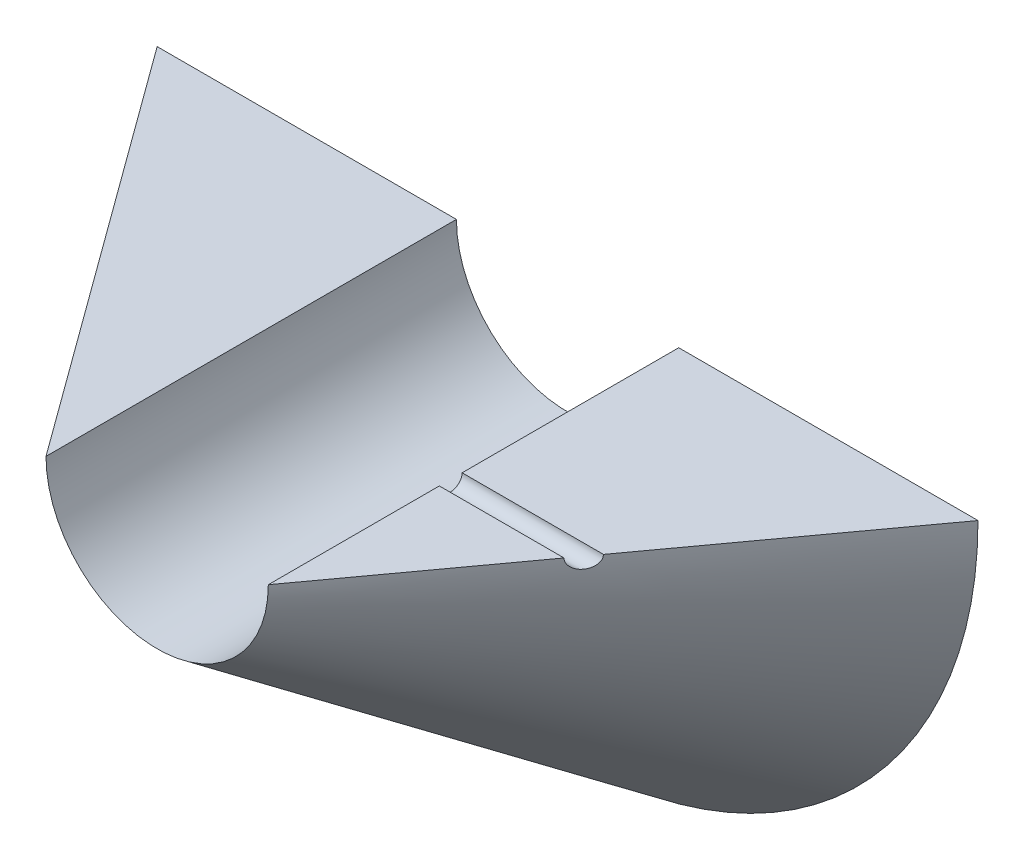
ISO-10303-21;
HEADER;
FILE_DESCRIPTION(('STEP AP214'),'2;1');
FILE_NAME('part.step','',(''),(''),'','','');
FILE_SCHEMA(('AUTOMOTIVE_DESIGN { 1 0 10303 214 1 1 1 1 }'));
ENDSEC;
DATA;
#1=APPLICATION_CONTEXT('core data for automotive mechanical design processes');
#2=APPLICATION_PROTOCOL_DEFINITION('international standard','automotive_design',2000,#1);
#3=PRODUCT_CONTEXT('',#1,'mechanical');
#4=PRODUCT('Part','Part','',(#3));
#5=PRODUCT_RELATED_PRODUCT_CATEGORY('part','',(#4));
#6=PRODUCT_DEFINITION_FORMATION('','',#4);
#7=PRODUCT_DEFINITION_CONTEXT('part definition',#1,'design');
#8=PRODUCT_DEFINITION('design','',#6,#7);
#9=PRODUCT_DEFINITION_SHAPE('','',#8);
#10=(LENGTH_UNIT() NAMED_UNIT(*) SI_UNIT(.MILLI.,.METRE.));
#11=(NAMED_UNIT(*) PLANE_ANGLE_UNIT() SI_UNIT($,.RADIAN.));
#12=(NAMED_UNIT(*) SI_UNIT($,.STERADIAN.) SOLID_ANGLE_UNIT());
#13=UNCERTAINTY_MEASURE_WITH_UNIT(LENGTH_MEASURE(1.E-05),#10,'distance_accuracy_value','');
#14=(GEOMETRIC_REPRESENTATION_CONTEXT(3) GLOBAL_UNCERTAINTY_ASSIGNED_CONTEXT((#13)) GLOBAL_UNIT_ASSIGNED_CONTEXT((#10,
#11,#12)) REPRESENTATION_CONTEXT('',''));
#15=CARTESIAN_POINT('',(0.,0.,0.));
#16=DIRECTION('',(0.,0.,1.));
#17=DIRECTION('',(1.,0.,0.));
#18=AXIS2_PLACEMENT_3D('',#15,#16,#17);
#19=CARTESIAN_POINT('',(0.,0.,180.));
#20=DIRECTION('',(0.,0.,1.));
#21=DIRECTION('',(1.,0.,0.));
#22=AXIS2_PLACEMENT_3D('',#19,#20,#21);
#23=CYLINDRICAL_SURFACE('',#22,48.75);
#24=DIRECTION('',(0.,0.,1.));
#25=VECTOR('',#24,1.);
#26=CARTESIAN_POINT('',(-48.75,0.,180.));
#27=LINE('',#26,#25);
#28=CARTESIAN_POINT('',(-48.75,0.,180.));
#29=VERTEX_POINT('',#28);
#30=CARTESIAN_POINT('',(-48.75,0.,0.));
#31=VERTEX_POINT('',#30);
#32=EDGE_CURVE('E49',#29,#31,#27,.F.);
#33=ORIENTED_EDGE('',*,*,#32,.F.);
#34=CARTESIAN_POINT('',(0.,0.,180.));
#35=DIRECTION('',(0.,0.,1.));
#36=DIRECTION('',(1.,0.,0.));
#37=AXIS2_PLACEMENT_3D('',#34,#35,#36);
#38=CIRCLE('',#37,48.75);
#39=CARTESIAN_POINT('',(48.75,0.,180.));
#40=VERTEX_POINT('',#39);
#41=EDGE_CURVE('E95',#29,#40,#38,.T.);
#42=ORIENTED_EDGE('',*,*,#41,.T.);
#43=DIRECTION('',(0.,0.,1.));
#44=VECTOR('',#43,1.);
#45=CARTESIAN_POINT('',(48.75,0.,180.));
#46=LINE('',#45,#44);
#47=CARTESIAN_POINT('',(48.75,0.,105.));
#48=VERTEX_POINT('',#47);
#49=EDGE_CURVE('E84',#48,#40,#46,.T.);
#50=ORIENTED_EDGE('',*,*,#49,.F.);
#51=CARTESIAN_POINT('',(48.75,0.,95.));
#52=CARTESIAN_POINT('',(48.750000389197,-0.14008100086284,94.9999986018309));
#53=CARTESIAN_POINT('',(48.7493950083053,-0.280140737873493,95.0058890159541));
#54=CARTESIAN_POINT('',(48.7469912287984,-0.559305925529234,95.0294068089419));
#55=CARTESIAN_POINT('',(48.7451925455075,-0.698411140459885,95.0470369884638));
#56=CARTESIAN_POINT('',(48.7404503592909,-0.974737830645201,95.0939279402502));
#57=CARTESIAN_POINT('',(48.737505949223,-1.11195772382351,95.1231979288691));
#58=CARTESIAN_POINT('',(48.7305544431504,-1.38347878134987,95.1931665631875));
#59=CARTESIAN_POINT('',(48.7265469582316,-1.51777885802131,95.2338693917857));
#60=CARTESIAN_POINT('',(48.7175873522136,-1.7823254585363,95.3263577551216));
#61=CARTESIAN_POINT('',(48.7126361631751,-1.91257583570178,95.3781323607879));
#62=CARTESIAN_POINT('',(48.701923936988,-2.16829177987035,95.4924361395613));
#63=CARTESIAN_POINT('',(48.696162601784,-2.2937555641763,95.5549692726647));
#64=CARTESIAN_POINT('',(48.6839968800058,-2.5388978794622,95.6902913994103));
#65=CARTESIAN_POINT('',(48.6775928619544,-2.65857966824321,95.7630745251197));
#66=CARTESIAN_POINT('',(48.6643161559048,-2.89144274282538,95.9184369559612));
#67=CARTESIAN_POINT('',(48.6574432951223,-3.00462160346189,96.0010198810297));
#68=CARTESIAN_POINT('',(48.6434027571373,-3.22397034323184,96.1756405164407));
#69=CARTESIAN_POINT('',(48.6362342596262,-3.33011824606443,96.2677057671708));
#70=CARTESIAN_POINT('',(48.6218213751467,-3.53432740876358,96.4604728753795));
#71=CARTESIAN_POINT('',(48.614576961105,-3.63238566486568,96.5611779128343));
#72=CARTESIAN_POINT('',(48.600221908122,-3.8196530425597,96.7704550377934));
#73=CARTESIAN_POINT('',(48.5931112269238,-3.90886499881192,96.8790245858134));
#74=CARTESIAN_POINT('',(48.5792198977998,-4.07787800390798,97.1033399806117));
#75=CARTESIAN_POINT('',(48.5724393726231,-4.15767556801212,97.219088460637));
#76=CARTESIAN_POINT('',(48.5593915128267,-4.30739554051586,97.4571373901257));
#77=CARTESIAN_POINT('',(48.55312516295,-4.37729917752714,97.5794497025295));
#78=CARTESIAN_POINT('',(48.5412967585839,-4.50657563732373,97.8296061375659));
#79=CARTESIAN_POINT('',(48.5357349658752,-4.56594454916064,97.9574522927828));
#80=CARTESIAN_POINT('',(48.5254804614672,-4.67366907148744,98.217689519941));
#81=CARTESIAN_POINT('',(48.5207874115692,-4.7220289694427,98.3500787993653));
#82=CARTESIAN_POINT('',(48.5124001208882,-4.80742627588238,98.6185052355794));
#83=CARTESIAN_POINT('',(48.5087062478272,-4.84445951652841,98.7545437151754));
#84=CARTESIAN_POINT('',(48.4993223283529,-4.93785036616057,99.1656124433031));
#85=CARTESIAN_POINT('',(48.4952805494567,-4.97700104155831,99.4448123428154));
#86=CARTESIAN_POINT('',(48.4920997750474,-5.00789044245951,100.005695122123));
#87=CARTESIAN_POINT('',(48.4929606443874,-4.99963047488887,100.287377933261));
#88=CARTESIAN_POINT('',(48.4994651170514,-4.9361304439657,100.84428299938));
#89=CARTESIAN_POINT('',(48.5050904528067,-4.88106981740609,101.119525809727));
#90=CARTESIAN_POINT('',(48.5204637315776,-4.72579415216424,101.65683235715));
#91=CARTESIAN_POINT('',(48.5302117328848,-4.62557847502081,101.918895907822));
#92=CARTESIAN_POINT('',(48.5527523909515,-4.38264425232442,102.422984278809));
#93=CARTESIAN_POINT('',(48.5655507320491,-4.23984622785899,102.664970536143));
#94=CARTESIAN_POINT('',(48.5927454108909,-3.91585672545949,103.12160957111));
#95=CARTESIAN_POINT('',(48.6071417978411,-3.73466406514936,103.336261506646));
#96=CARTESIAN_POINT('',(48.6359918294384,-3.3380272417351,103.733182554229));
#97=CARTESIAN_POINT('',(48.6504454299169,-3.12242809707303,103.915296835475));
#98=CARTESIAN_POINT('',(48.6777183357708,-2.66363602583515,104.24077219106));
#99=CARTESIAN_POINT('',(48.6905376391663,-2.42044306583126,104.384133218452));
#100=CARTESIAN_POINT('',(48.7131020876591,-1.91325834758283,104.628027014304));
#101=CARTESIAN_POINT('',(48.7228466565943,-1.64926270277589,104.728551757082));
#102=CARTESIAN_POINT('',(48.7381578744169,-1.10801780887595,104.883805091289));
#103=CARTESIAN_POINT('',(48.7437246547517,-0.830768977065377,104.938535123583));
#104=CARTESIAN_POINT('',(48.7500361632012,-0.272228441535443,105.00044864221));
#105=CARTESIAN_POINT('',(48.7508025560036,0.00903934777978221,105.007845750611));
#106=CARTESIAN_POINT('',(48.7474850668982,0.568810634624786,104.975444758929));
#107=CARTESIAN_POINT('',(48.7434012539818,0.847314171417597,104.93564733016));
#108=CARTESIAN_POINT('',(48.7308560801636,1.39303341447142,104.81016423428));
#109=CARTESIAN_POINT('',(48.7224042785875,1.66027239745354,104.724578759789));
#110=CARTESIAN_POINT('',(48.7020711161284,2.17660055900645,104.510052035007));
#111=CARTESIAN_POINT('',(48.6901896745848,2.42568931053593,104.381109765012));
#112=CARTESIAN_POINT('',(48.6642718407333,2.8996110877734,104.083001330848));
#113=CARTESIAN_POINT('',(48.6502280017268,3.12435554042963,103.913695015106));
#114=CARTESIAN_POINT('',(48.621584691777,3.54231194552546,103.539864177106));
#115=CARTESIAN_POINT('',(48.606985206158,3.73552306438865,103.335338724132));
#116=CARTESIAN_POINT('',(48.5788106240481,4.08567185517549,102.895946149536));
#117=CARTESIAN_POINT('',(48.5652396221104,4.24246919531283,102.660966909692));
#118=CARTESIAN_POINT('',(48.5407216552142,4.51437295777038,102.167875136452));
#119=CARTESIAN_POINT('',(48.5297746527683,4.62947997570706,101.909762933614));
#120=CARTESIAN_POINT('',(48.511768592767,4.8145067034086,101.378263175584));
#121=CARTESIAN_POINT('',(48.5047023901735,4.88450949714478,101.104904720184));
#122=CARTESIAN_POINT('',(48.4952408395981,4.97759035860086,100.550083631075));
#123=CARTESIAN_POINT('',(48.4928453500628,5.00066984840871,100.268621243232));
#124=CARTESIAN_POINT('',(48.4929473956605,4.99964290141229,99.8474570227359));
#125=CARTESIAN_POINT('',(48.4935928392565,4.99340252271699,99.7074908372863));
#126=CARTESIAN_POINT('',(48.4960784705341,4.96921054801502,99.4285989653847));
#127=CARTESIAN_POINT('',(48.4979182145855,4.95126330058479,99.2896729119443));
#128=CARTESIAN_POINT('',(48.5027427204151,4.90377491789048,99.0137948239799));
#129=CARTESIAN_POINT('',(48.5057279015383,4.87422953645153,98.8768435314916));
#130=CARTESIAN_POINT('',(48.5127559314431,4.80377618536093,98.6059744620394));
#131=CARTESIAN_POINT('',(48.5167983936194,4.76287236869493,98.4720555956482));
#132=CARTESIAN_POINT('',(48.525827445254,4.66998352416419,98.2081206581476));
#133=CARTESIAN_POINT('',(48.5308142285033,4.6179962215002,98.0781053944811));
#134=CARTESIAN_POINT('',(48.5415877348515,4.50334014269483,97.8229651191824));
#135=CARTESIAN_POINT('',(48.5473741657096,4.4406752668614,97.6978383423255));
#136=CARTESIAN_POINT('',(48.5595869146512,4.30507283476307,97.453255580476));
#137=CARTESIAN_POINT('',(48.5660134594491,4.23213163503253,97.3338016269521));
#138=CARTESIAN_POINT('',(48.5793210747985,4.0765372254649,97.1014861820133));
#139=CARTESIAN_POINT('',(48.5862019798918,3.99388754258636,96.9886223186799));
#140=CARTESIAN_POINT('',(48.6002611013155,3.8190116579077,96.7696946920308));
#141=CARTESIAN_POINT('',(48.6074405953638,3.72674104488739,96.6636664823935));
#142=CARTESIAN_POINT('',(48.6218597096454,3.5336420168319,96.4597909416014));
#143=CARTESIAN_POINT('',(48.6290993069958,3.4328167350974,96.3619406409847));
#144=CARTESIAN_POINT('',(48.6434412404114,3.22322228659948,96.1750073996124));
#145=CARTESIAN_POINT('',(48.650543490368,3.1144483284338,96.0859298242102));
#146=CARTESIAN_POINT('',(48.6644030484974,2.88981516863571,95.9172695742775));
#147=CARTESIAN_POINT('',(48.6711604830766,2.77395859816484,95.8376834057625));
#148=CARTESIAN_POINT('',(48.6841620584364,2.53557744063651,95.6883076711548));
#149=CARTESIAN_POINT('',(48.6904045927547,2.41303383009732,95.6185483180658));
#150=CARTESIAN_POINT('',(48.7021740092982,2.16251348650119,95.4896370889704));
#151=CARTESIAN_POINT('',(48.7077011534379,2.03453876476771,95.4304813277677));
#152=CARTESIAN_POINT('',(48.7178810869501,1.77412573229979,95.3232180732733));
#153=CARTESIAN_POINT('',(48.7225345887302,1.64169116318527,95.275101570895));
#154=CARTESIAN_POINT('',(48.7308395507551,1.37324976919271,95.1902179849387));
#155=CARTESIAN_POINT('',(48.734491256199,1.23724382738741,95.1534481238882));
#156=CARTESIAN_POINT('',(48.7416578208933,0.919647422003384,95.0818324431433));
#157=CARTESIAN_POINT('',(48.7447736658721,0.737087728326719,95.0511749660776));
#158=CARTESIAN_POINT('',(48.7489444941515,0.36967301153783,95.0102597116689));
#159=CARTESIAN_POINT('',(48.749999486507,0.184817998514194,95.0000018446957));
#160=CARTESIAN_POINT('',(48.75,0.,95.));
#161=B_SPLINE_CURVE_WITH_KNOTS('',3,(#51,#52,#53,#54,#55,#56,#57,#58,#59,#60,#61,#62,#63,#64,
#65,#66,#67,#68,#69,#70,#71,#72,#73,#74,#75,#76,#77,#78,#79,#80,#81,#82,#83,#84,#85,#86,#87,#88,
#89,#90,#91,#92,#93,#94,#95,#96,#97,#98,#99,#100,#101,#102,#103,#104,#105,#106,#107,#108,#109,
#110,#111,#112,#113,#114,#115,#116,#117,#118,#119,#120,#121,#122,#123,#124,#125,#126,#127,#128,
#129,#130,#131,#132,#133,#134,#135,#136,#137,#138,#139,#140,#141,#142,#143,#144,#145,#146,#147,
#148,#149,#150,#151,#152,#153,#154,#155,#156,#157,#158,#159,#160),.UNSPECIFIED.,.T.,.F.,(4,2,2,
2,2,2,2,2,2,2,2,2,2,2,2,2,2,2,2,2,2,2,2,2,2,2,2,2,2,2,2,2,2,2,2,2,2,2,2,2,2,2,2,2,2,2,2,2,2,2,2,
2,2,2,4),(0.,0.420081372263408,0.840262995736704,1.26077798189679,1.68144702145216,
2.1017027151597,2.52211342872985,2.9422844359281,3.36261113558632,3.78419502857095,
4.20593476173172,4.62753891521351,5.04929863919035,5.47184812352873,5.89455414991491,
6.31709527054133,6.7397916859001,7.58128440501172,8.42275392757352,9.26101167859738,
10.0992812823782,10.939125394758,11.7789953741871,12.62276120516,13.4665280583104,
14.3104529277644,15.1543512433517,15.9944381904937,16.8345131880398,17.6727574216204,
18.5110213711709,19.352239444942,20.1934797525183,21.0379101468124,21.8823284765202,
22.7251868695829,23.5680197180541,23.9879313067028,24.4076870057928,24.8275965245294,
25.2473527134102,25.6671951370627,26.086884528002,26.5067230958436,26.92640961108,
27.3481272649718,27.7696911185456,28.1915112178113,28.6131755538511,29.0361092707313,
29.458887704913,29.8813198745028,30.3036485574235,30.8578917387347,31.4121324848502),.UNSPECIFIED.);
#162=CARTESIAN_POINT('',(48.75,0.,95.));
#163=VERTEX_POINT('',#162);
#164=EDGE_CURVE('E94',#163,#48,#161,.T.);
#165=ORIENTED_EDGE('',*,*,#164,.F.);
#166=CARTESIAN_POINT('',(48.75,0.,0.));
#167=VERTEX_POINT('',#166);
#168=EDGE_CURVE('E98',#167,#163,#46,.T.);
#169=ORIENTED_EDGE('',*,*,#168,.F.);
#170=CARTESIAN_POINT('',(0.,0.,0.));
#171=DIRECTION('',(0.,0.,1.));
#172=DIRECTION('',(1.,0.,0.));
#173=AXIS2_PLACEMENT_3D('',#170,#171,#172);
#174=CIRCLE('',#173,48.75);
#175=EDGE_CURVE('E91',#31,#167,#174,.T.);
#176=ORIENTED_EDGE('',*,*,#175,.F.);
#177=EDGE_LOOP('',(#33,#42,#50,#165,#169,#176));
#178=FACE_BOUND('',#177,.T.);
#179=ADVANCED_FACE('F34',(#178),#23,.F.);
#180=CARTESIAN_POINT('',(0.,0.,0.));
#181=DIRECTION('',(0.,0.,-1.));
#182=DIRECTION('',(-1.,0.,0.));
#183=AXIS2_PLACEMENT_3D('',#180,#181,#182);
#184=CONICAL_SURFACE('',#183,180.,0.630033909545915);
#185=DIRECTION('',(0.589172157449442,0.,-0.808007530216377));
#186=VECTOR('',#185,1.);
#187=CARTESIAN_POINT('',(0.,0.,246.857142857143));
#188=LINE('',#187,#186);
#189=CARTESIAN_POINT('',(103.4375,0.,105.));
#190=VERTEX_POINT('',#189);
#191=EDGE_CURVE('E86',#40,#190,#188,.T.);
#192=ORIENTED_EDGE('',*,*,#191,.F.);
#193=ORIENTED_EDGE('',*,*,#41,.F.);
#194=DIRECTION('',(0.589172157449442,0.,0.808007530216377));
#195=VECTOR('',#194,1.);
#196=CARTESIAN_POINT('',(0.,0.,246.857142857143));
#197=LINE('',#196,#195);
#198=CARTESIAN_POINT('',(-180.,0.,0.));
#199=VERTEX_POINT('',#198);
#200=EDGE_CURVE('E176',#199,#29,#197,.T.);
#201=ORIENTED_EDGE('',*,*,#200,.F.);
#202=CARTESIAN_POINT('',(0.,0.,0.));
#203=DIRECTION('',(0.,0.,1.));
#204=DIRECTION('',(1.,0.,0.));
#205=AXIS2_PLACEMENT_3D('',#202,#203,#204);
#206=CIRCLE('',#205,180.);
#207=CARTESIAN_POINT('',(180.,0.,0.));
#208=VERTEX_POINT('',#207);
#209=EDGE_CURVE('E102',#199,#208,#206,.T.);
#210=ORIENTED_EDGE('',*,*,#209,.T.);
#211=CARTESIAN_POINT('',(110.729166666667,0.,95.));
#212=VERTEX_POINT('',#211);
#213=EDGE_CURVE('E96',#212,#208,#188,.T.);
#214=ORIENTED_EDGE('',*,*,#213,.F.);
#215=CARTESIAN_POINT('',(103.984458415502,-2.71070320161313,104.201438819353));
#216=CARTESIAN_POINT('',(103.940710152939,-2.61229231644573,104.264933142465));
#217=CARTESIAN_POINT('',(103.899112602503,-2.51098517642877,104.32539541103));
#218=CARTESIAN_POINT('',(103.820600442907,-2.30294989717016,104.439650459376));
#219=CARTESIAN_POINT('',(103.783684846781,-2.19622290710788,104.493444644747));
#220=CARTESIAN_POINT('',(103.714886216869,-1.97773271987816,104.593804358103));
#221=CARTESIAN_POINT('',(103.683007533823,-1.86596527485606,104.640363636218));
#222=CARTESIAN_POINT('',(103.624698441801,-1.63813753098462,104.725599396526));
#223=CARTESIAN_POINT('',(103.598265619527,-1.52207916063957,104.764279370294));
#224=CARTESIAN_POINT('',(103.551051687983,-1.28580865093077,104.833416516934));
#225=CARTESIAN_POINT('',(103.530297091497,-1.16557988328282,104.863835111087));
#226=CARTESIAN_POINT('',(103.494887586611,-0.922376455113686,104.915757842227));
#227=CARTESIAN_POINT('',(103.480230228949,-0.799402918123277,104.937265558699));
#228=CARTESIAN_POINT('',(103.457212986615,-0.551629058519088,104.971049767359));
#229=CARTESIAN_POINT('',(103.44885206846,-0.426829039129523,104.983327774489));
#230=CARTESIAN_POINT('',(103.438547156485,-0.176397811429772,104.998461512356));
#231=CARTESIAN_POINT('',(103.436602823791,-0.0507666473652462,105.001317740678));
#232=CARTESIAN_POINT('',(103.439083102795,0.19290302141914,104.997674773743));
#233=CARTESIAN_POINT('',(103.443140162064,0.310953868374315,104.991715480335));
#234=CARTESIAN_POINT('',(103.456911296634,0.546049651999109,104.971494091243));
#235=CARTESIAN_POINT('',(103.46662727066,0.663094237657593,104.9572292088));
#236=CARTESIAN_POINT('',(103.491587874049,0.895260567369744,104.920601033937));
#237=CARTESIAN_POINT('',(103.506830368835,1.01038303589298,104.898240868266));
#238=CARTESIAN_POINT('',(103.542661368094,1.23802517061115,104.845714208637));
#239=CARTESIAN_POINT('',(103.563251909677,1.35054382716937,104.815544740073));
#240=CARTESIAN_POINT('',(103.609520435724,1.57217015213002,104.747809431295));
#241=CARTESIAN_POINT('',(103.63519489784,1.6812801219498,104.710248712153));
#242=CARTESIAN_POINT('',(103.69135768952,1.89558801995827,104.628167337065));
#243=CARTESIAN_POINT('',(103.721847713757,2.00078455478346,104.583644230998));
#244=CARTESIAN_POINT('',(103.820076135915,2.30966044472652,104.440370473503));
#245=CARTESIAN_POINT('',(103.894605279611,2.50677892717922,104.3318678511));
#246=CARTESIAN_POINT('',(104.067084158432,2.89837944764943,104.081499269281));
#247=CARTESIAN_POINT('',(104.166610279001,3.09072422809052,103.937409955628));
#248=CARTESIAN_POINT('',(104.38082833992,3.44827281527613,103.628402473468));
#249=CARTESIAN_POINT('',(104.495527940382,3.61346281823014,103.463473786403));
#250=CARTESIAN_POINT('',(104.756462714437,3.94012725927042,103.089742458919));
#251=CARTESIAN_POINT('',(104.904801938981,4.09672109560923,102.878151310574));
#252=CARTESIAN_POINT('',(105.213605024728,4.37201650188717,102.439788479745));
#253=CARTESIAN_POINT('',(105.374076316736,4.49069461234763,102.213007503456));
#254=CARTESIAN_POINT('',(105.733761439532,4.70899131697108,101.707182946707));
#255=CARTESIAN_POINT('',(105.934701062432,4.80117875032557,101.426154702186));
#256=CARTESIAN_POINT('',(106.343772636994,4.93461218825182,100.857345875523));
#257=CARTESIAN_POINT('',(106.551908527052,4.97582982932774,100.569561624498));
#258=CARTESIAN_POINT('',(107.002230706905,5.01073449771237,99.9504170406677));
#259=CARTESIAN_POINT('',(107.244882559442,4.99645201245636,99.6189335447323));
#260=CARTESIAN_POINT('',(107.728064691258,4.9024794037955,98.9629138532056));
#261=CARTESIAN_POINT('',(107.968592290743,4.82271606018008,98.6383858522362));
#262=CARTESIAN_POINT('',(108.327576554776,4.65116554144732,98.1567578930231));
#263=CARTESIAN_POINT('',(108.449603657311,4.58320504464219,97.9935421441669));
#264=CARTESIAN_POINT('',(108.689962917362,4.42905200962663,97.6729577941818));
#265=CARTESIAN_POINT('',(108.808294413299,4.34285622820769,97.5155902390355));
#266=CARTESIAN_POINT('',(109.039669186551,4.15225482019592,97.208702375639));
#267=CARTESIAN_POINT('',(109.152722095788,4.04788414747182,97.0591677085126));
#268=CARTESIAN_POINT('',(109.372224473872,3.82073453410554,96.7695406890657));
#269=CARTESIAN_POINT('',(109.47867449444,3.69795713442162,96.6294475477497));
#270=CARTESIAN_POINT('',(109.718037851861,3.38901131950929,96.3151322708466));
#271=CARTESIAN_POINT('',(109.847648487688,3.19548066690098,96.1454938638345));
#272=CARTESIAN_POINT('',(110.086494383742,2.77660406443886,95.833645570296));
#273=CARTESIAN_POINT('',(110.195758790032,2.55130445014785,95.691396438414));
#274=CARTESIAN_POINT('',(110.373471681238,2.10831344011402,95.4604573146488));
#275=CARTESIAN_POINT('',(110.445600418646,1.89467635220449,95.3669119380516));
#276=CARTESIAN_POINT('',(110.536817526026,1.56186921256396,95.2487382651109));
#277=CARTESIAN_POINT('',(110.564400652037,1.44883270259665,95.2130290552202));
#278=CARTESIAN_POINT('',(110.613504215064,1.21930051042701,95.1494886398799));
#279=CARTESIAN_POINT('',(110.635027180791,1.10280629351304,95.1216541485377));
#280=CARTESIAN_POINT('',(110.671750596817,0.866526814478904,95.0741769648894));
#281=CARTESIAN_POINT('',(110.686917216094,0.746727471169517,95.0545781044819));
#282=CARTESIAN_POINT('',(110.710488307072,0.505410819972867,95.024124112204));
#283=CARTESIAN_POINT('',(110.718895685655,0.383894273490889,95.0132652216161));
#284=CARTESIAN_POINT('',(110.728800014348,0.140110970194743,95.0004732904261));
#285=CARTESIAN_POINT('',(110.730297004349,0.0178442177152859,94.9985401982991));
#286=CARTESIAN_POINT('',(110.72635244841,-0.22638334146736,95.0036344664669));
#287=CARTESIAN_POINT('',(110.720911323922,-0.348344166303044,95.0106612824977));
#288=CARTESIAN_POINT('',(110.703927944624,-0.580877180075577,95.0325997981357));
#289=CARTESIAN_POINT('',(110.69292838713,-0.691555927002531,95.0468101700464));
#290=CARTESIAN_POINT('',(110.66535660826,-0.911053147491465,95.0824429398805));
#291=CARTESIAN_POINT('',(110.648782604064,-1.01987101419158,95.1038676450957));
#292=CARTESIAN_POINT('',(110.591047489148,-1.34239889760392,95.1785340734845));
#293=CARTESIAN_POINT('',(110.541857610061,-1.55238988212975,95.2421882979282));
#294=CARTESIAN_POINT('',(110.422465798715,-1.96523475301935,95.3969146748232));
#295=CARTESIAN_POINT('',(110.35153432919,-2.16751137805414,95.4889395493118));
#296=CARTESIAN_POINT('',(110.192725495089,-2.55304128665783,95.6953708823547));
#297=CARTESIAN_POINT('',(110.104841169738,-2.73628670838206,95.8097865347525));
#298=CARTESIAN_POINT('',(109.901072868682,-3.10795747826696,96.0756689022859));
#299=CARTESIAN_POINT('',(109.782965717195,-3.2930172975676,96.2301199730906));
#300=CARTESIAN_POINT('',(109.53288015376,-3.63451998591007,96.5581377072116));
#301=CARTESIAN_POINT('',(109.400893047563,-3.79094474813214,96.7317163551259));
#302=CARTESIAN_POINT('',(109.098561979716,-4.10407732519965,97.1306268141172));
#303=CARTESIAN_POINT('',(108.925893135083,-4.25430391034733,97.3592838324198));
#304=CARTESIAN_POINT('',(108.570665376046,-4.51346437036094,97.8317412778158));
#305=CARTESIAN_POINT('',(108.388100196795,-4.62237173093297,98.075551312135));
#306=CARTESIAN_POINT('',(107.981168527921,-4.81655089796354,98.6215197515161));
#307=CARTESIAN_POINT('',(107.755548490112,-4.89317296048507,98.925840575887));
#308=CARTESIAN_POINT('',(107.301637389169,-4.9887041704776,99.5416762989334));
#309=CARTESIAN_POINT('',(107.073344216557,-5.00756415308837,99.8531970988781));
#310=CARTESIAN_POINT('',(106.594870867599,-4.98589197577594,100.510063954498));
#311=CARTESIAN_POINT('',(106.34498528373,-4.93873572997116,100.855434954895));
#312=CARTESIAN_POINT('',(105.855891937608,-4.77110646764184,101.53600070705));
#313=CARTESIAN_POINT('',(105.616680681954,-4.65065762938292,101.871198776456));
#314=CARTESIAN_POINT('',(105.20556794218,-4.36732177796837,102.451044234308));
#315=CARTESIAN_POINT('',(105.030048113206,-4.21856683457454,102.699974305601));
#316=CARTESIAN_POINT('',(104.780101722293,-3.95996155027685,103.056175070766));
#317=CARTESIAN_POINT('',(104.699072500086,-3.8679420475178,103.171950672504));
#318=CARTESIAN_POINT('',(104.542111946771,-3.67210145065501,103.396743570942));
#319=CARTESIAN_POINT('',(104.466178381727,-3.56828558255705,103.505763827559));
#320=CARTESIAN_POINT('',(104.318206604624,-3.34600683017264,103.718679274712));
#321=CARTESIAN_POINT('',(104.24633292108,-3.22721968412274,103.822351104784));
#322=CARTESIAN_POINT('',(104.109749127355,-2.97771027973184,104.019768770407));
#323=CARTESIAN_POINT('',(104.045041555103,-2.84698382271701,104.113511088843));
#324=CARTESIAN_POINT('',(103.984458415502,-2.71070320161313,104.201438819353));
#325=B_SPLINE_CURVE_WITH_KNOTS('',3,(#215,#216,#217,#218,#219,#220,#221,#222,#223,#224,#225,
#226,#227,#228,#229,#230,#231,#232,#233,#234,#235,#236,#237,#238,#239,#240,#241,#242,#243,#244,
#245,#246,#247,#248,#249,#250,#251,#252,#253,#254,#255,#256,#257,#258,#259,#260,#261,#262,#263,
#264,#265,#266,#267,#268,#269,#270,#271,#272,#273,#274,#275,#276,#277,#278,#279,#280,#281,#282,
#283,#284,#285,#286,#287,#288,#289,#290,#291,#292,#293,#294,#295,#296,#297,#298,#299,#300,#301,
#302,#303,#304,#305,#306,#307,#308,#309,#310,#311,#312,#313,#314,#315,#316,#317,#318,#319,#320,
#321,#322,#323,#324),.UNSPECIFIED.,.T.,.F.,(4,2,2,2,2,2,2,2,2,2,2,2,2,2,2,2,2,2,2,2,2,2,2,2,2,2,
2,2,2,2,2,2,2,2,2,2,2,2,2,2,2,2,2,2,2,2,2,2,2,2,2,2,2,2,4),(0.,0.374943105475142,
0.749807040431102,1.12499302248371,1.50001238405056,1.87675400911221,2.25334415058903,
2.62987246595927,3.00638089574639,3.36076406365179,3.71526620561966,4.06963156936687,
4.42413211196901,4.77838789613848,5.13276862751649,5.84104547041635,6.6184886644882,
7.39632584805654,8.29940173073475,9.20303529345246,10.271583086226,11.3407252336303,
12.5686756761658,13.79800107706,14.441736207024,15.0855859239057,15.7282107982473,
16.3707819038934,17.2317516922097,18.0914784865261,18.8204500891496,19.1851942691776,
19.5497860267665,19.9162943734314,20.2826450149138,20.6489935416019,21.015319815736,
21.3513027523162,21.6873932453457,22.3589570074241,23.0561222314345,23.7535743203226,
24.5559169051543,25.3587650962707,26.3257628574097,27.2933800897954,28.4482095977997,
29.6040217794624,30.8844750294964,32.1645061036137,33.1769946047275,33.6823697498814,
34.1875218711503,34.7065645209401,35.2257904094772),.UNSPECIFIED.);
#326=EDGE_CURVE('E100',#212,#190,#325,.T.);
#327=ORIENTED_EDGE('',*,*,#326,.T.);
#328=EDGE_LOOP('',(#192,#193,#201,#210,#214,#327));
#329=FACE_BOUND('',#328,.T.);
#330=ADVANCED_FACE('F121',(#329),#184,.T.);
#331=CARTESIAN_POINT('',(0.,48.75,0.));
#332=DIRECTION('',(0.,0.,1.));
#333=DIRECTION('',(1.,0.,0.));
#334=AXIS2_PLACEMENT_3D('',#331,#332,#333);
#335=PLANE('',#334);
#336=DIRECTION('',(-1.,0.,0.));
#337=VECTOR('',#336,1.);
#338=CARTESIAN_POINT('',(0.,0.,0.));
#339=LINE('',#338,#337);
#340=EDGE_CURVE('E179',#208,#167,#339,.T.);
#341=ORIENTED_EDGE('',*,*,#340,.F.);
#342=ORIENTED_EDGE('',*,*,#209,.F.);
#343=EDGE_CURVE('E57',#31,#199,#339,.T.);
#344=ORIENTED_EDGE('',*,*,#343,.F.);
#345=ORIENTED_EDGE('',*,*,#175,.T.);
#346=EDGE_LOOP('',(#341,#342,#344,#345));
#347=FACE_BOUND('',#346,.T.);
#348=ADVANCED_FACE('F116',(#347),#335,.F.);
#349=CARTESIAN_POINT('',(180.001,0.,100.));
#350=DIRECTION('',(-1.,0.,0.));
#351=DIRECTION('',(0.,0.,1.));
#352=AXIS2_PLACEMENT_3D('',#349,#350,#351);
#353=CYLINDRICAL_SURFACE('',#352,5.);
#354=ORIENTED_EDGE('',*,*,#326,.F.);
#355=DIRECTION('',(-1.,0.,0.));
#356=VECTOR('',#355,1.);
#357=CARTESIAN_POINT('',(180.001,0.,95.));
#358=LINE('',#357,#356);
#359=EDGE_CURVE('E12',#212,#163,#358,.T.);
#360=ORIENTED_EDGE('',*,*,#359,.T.);
#361=ORIENTED_EDGE('',*,*,#164,.T.);
#362=DIRECTION('',(-1.,0.,0.));
#363=VECTOR('',#362,1.);
#364=CARTESIAN_POINT('',(180.001,0.,105.));
#365=LINE('',#364,#363);
#366=EDGE_CURVE('E42',#48,#190,#365,.F.);
#367=ORIENTED_EDGE('',*,*,#366,.T.);
#368=EDGE_LOOP('',(#354,#360,#361,#367));
#369=FACE_BOUND('',#368,.T.);
#370=ADVANCED_FACE('F99',(#369),#353,.F.);
#371=CARTESIAN_POINT('',(0.,0.,0.));
#372=DIRECTION('',(0.,1.,0.));
#373=DIRECTION('',(0.,0.,1.));
#374=AXIS2_PLACEMENT_3D('',#371,#372,#373);
#375=PLANE('',#374);
#376=ORIENTED_EDGE('',*,*,#366,.F.);
#377=ORIENTED_EDGE('',*,*,#49,.T.);
#378=ORIENTED_EDGE('',*,*,#191,.T.);
#379=EDGE_LOOP('',(#376,#377,#378));
#380=FACE_BOUND('',#379,.T.);
#381=ADVANCED_FACE('F83',(#380),#375,.T.);
#382=ORIENTED_EDGE('',*,*,#213,.T.);
#383=ORIENTED_EDGE('',*,*,#340,.T.);
#384=ORIENTED_EDGE('',*,*,#168,.T.);
#385=ORIENTED_EDGE('',*,*,#359,.F.);
#386=EDGE_LOOP('',(#382,#383,#384,#385));
#387=FACE_BOUND('',#386,.T.);
#388=ADVANCED_FACE('F155',(#387),#375,.T.);
#389=ORIENTED_EDGE('',*,*,#200,.T.);
#390=ORIENTED_EDGE('',*,*,#32,.T.);
#391=ORIENTED_EDGE('',*,*,#343,.T.);
#392=EDGE_LOOP('',(#389,#390,#391));
#393=FACE_BOUND('',#392,.T.);
#394=ADVANCED_FACE('F117',(#393),#375,.T.);
#395=CLOSED_SHELL('',(#179,#330,#348,#370,#381,#388,#394));
#396=MANIFOLD_SOLID_BREP('B2',#395);
#397=ADVANCED_BREP_SHAPE_REPRESENTATION('',(#18,#396),#14);
#398=SHAPE_DEFINITION_REPRESENTATION(#9,#397);
ENDSEC;
END-ISO-10303-21;
